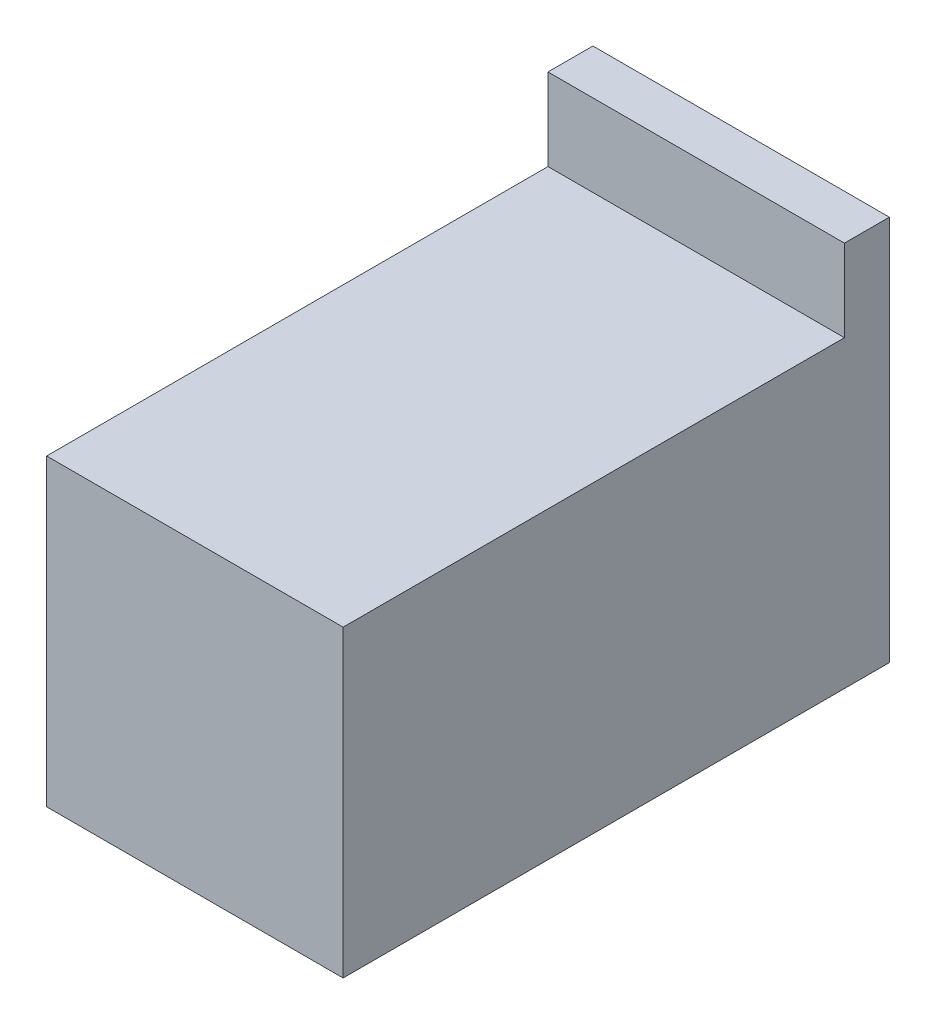
ISO-10303-21;
HEADER;
FILE_DESCRIPTION(('STEP AP214'),'2;1');
FILE_NAME('part.step','',(''),(''),'','','');
FILE_SCHEMA(('AUTOMOTIVE_DESIGN { 1 0 10303 214 1 1 1 1 }'));
ENDSEC;
DATA;
#1=APPLICATION_CONTEXT('core data for automotive mechanical design processes');
#2=APPLICATION_PROTOCOL_DEFINITION('international standard','automotive_design',2000,#1);
#3=PRODUCT_CONTEXT('',#1,'mechanical');
#4=PRODUCT('Part','Part','',(#3));
#5=PRODUCT_RELATED_PRODUCT_CATEGORY('part','',(#4));
#6=PRODUCT_DEFINITION_FORMATION('','',#4);
#7=PRODUCT_DEFINITION_CONTEXT('part definition',#1,'design');
#8=PRODUCT_DEFINITION('design','',#6,#7);
#9=PRODUCT_DEFINITION_SHAPE('','',#8);
#10=(LENGTH_UNIT() NAMED_UNIT(*) SI_UNIT(.MILLI.,.METRE.));
#11=(NAMED_UNIT(*) PLANE_ANGLE_UNIT() SI_UNIT($,.RADIAN.));
#12=(NAMED_UNIT(*) SI_UNIT($,.STERADIAN.) SOLID_ANGLE_UNIT());
#13=UNCERTAINTY_MEASURE_WITH_UNIT(LENGTH_MEASURE(1.E-05),#10,'distance_accuracy_value','');
#14=(GEOMETRIC_REPRESENTATION_CONTEXT(3) GLOBAL_UNCERTAINTY_ASSIGNED_CONTEXT((#13)) GLOBAL_UNIT_ASSIGNED_CONTEXT((#10,
#11,#12)) REPRESENTATION_CONTEXT('',''));
#15=CARTESIAN_POINT('',(0.,0.,0.));
#16=DIRECTION('',(0.,0.,1.));
#17=DIRECTION('',(1.,0.,0.));
#18=AXIS2_PLACEMENT_3D('',#15,#16,#17);
#19=CARTESIAN_POINT('',(-21.71,22.25,80.));
#20=DIRECTION('',(0.,-1.,0.));
#21=DIRECTION('',(0.,0.,-1.));
#22=AXIS2_PLACEMENT_3D('',#19,#20,#21);
#23=PLANE('',#22);
#24=DIRECTION('',(1.,0.,0.));
#25=VECTOR('',#24,1.);
#26=CARTESIAN_POINT('',(0.,22.25,6.58));
#27=LINE('',#26,#25);
#28=CARTESIAN_POINT('',(-21.71,22.25,6.58));
#29=VERTEX_POINT('',#28);
#30=CARTESIAN_POINT('',(21.71,22.25,6.58));
#31=VERTEX_POINT('',#30);
#32=EDGE_CURVE('E60',#29,#31,#27,.T.);
#33=ORIENTED_EDGE('',*,*,#32,.F.);
#34=DIRECTION('',(0.,0.,-1.));
#35=VECTOR('',#34,1.);
#36=CARTESIAN_POINT('',(-21.71,22.25,80.));
#37=LINE('',#36,#35);
#38=CARTESIAN_POINT('',(-21.71,22.25,80.));
#39=VERTEX_POINT('',#38);
#40=EDGE_CURVE('E54',#39,#29,#37,.T.);
#41=ORIENTED_EDGE('',*,*,#40,.F.);
#42=DIRECTION('',(-1.,0.,0.));
#43=VECTOR('',#42,1.);
#44=CARTESIAN_POINT('',(-21.71,22.25,80.));
#45=LINE('',#44,#43);
#46=CARTESIAN_POINT('',(21.71,22.25,80.));
#47=VERTEX_POINT('',#46);
#48=EDGE_CURVE('E89',#47,#39,#45,.T.);
#49=ORIENTED_EDGE('',*,*,#48,.F.);
#50=DIRECTION('',(0.,0.,-1.));
#51=VECTOR('',#50,1.);
#52=CARTESIAN_POINT('',(21.71,22.25,80.));
#53=LINE('',#52,#51);
#54=EDGE_CURVE('E11',#47,#31,#53,.T.);
#55=ORIENTED_EDGE('',*,*,#54,.T.);
#56=EDGE_LOOP('',(#33,#41,#49,#55));
#57=FACE_BOUND('',#56,.T.);
#58=ADVANCED_FACE('F45',(#57),#23,.F.);
#59=CARTESIAN_POINT('',(21.71,-22.25,80.));
#60=DIRECTION('',(-1.,0.,0.));
#61=DIRECTION('',(0.,0.,1.));
#62=AXIS2_PLACEMENT_3D('',#59,#60,#61);
#63=PLANE('',#62);
#64=DIRECTION('',(0.,1.,0.));
#65=VECTOR('',#64,1.);
#66=CARTESIAN_POINT('',(21.71,-22.25,0.));
#67=LINE('',#66,#65);
#68=CARTESIAN_POINT('',(21.71,-22.25,0.));
#69=VERTEX_POINT('',#68);
#70=CARTESIAN_POINT('',(21.71,34.25,0.));
#71=VERTEX_POINT('',#70);
#72=EDGE_CURVE('E131',#69,#71,#67,.T.);
#73=ORIENTED_EDGE('',*,*,#72,.T.);
#74=DIRECTION('',(0.,0.,-1.));
#75=VECTOR('',#74,1.);
#76=CARTESIAN_POINT('',(21.71,34.25,0.));
#77=LINE('',#76,#75);
#78=CARTESIAN_POINT('',(21.71,34.25,6.58));
#79=VERTEX_POINT('',#78);
#80=EDGE_CURVE('E117',#79,#71,#77,.T.);
#81=ORIENTED_EDGE('',*,*,#80,.F.);
#82=DIRECTION('',(0.,-1.,0.));
#83=VECTOR('',#82,1.);
#84=CARTESIAN_POINT('',(21.71,34.25,6.58));
#85=LINE('',#84,#83);
#86=EDGE_CURVE('E112',#79,#31,#85,.T.);
#87=ORIENTED_EDGE('',*,*,#86,.T.);
#88=ORIENTED_EDGE('',*,*,#54,.F.);
#89=DIRECTION('',(0.,1.,0.));
#90=VECTOR('',#89,1.);
#91=CARTESIAN_POINT('',(21.71,-22.25,80.));
#92=LINE('',#91,#90);
#93=CARTESIAN_POINT('',(21.71,-22.25,80.));
#94=VERTEX_POINT('',#93);
#95=EDGE_CURVE('E140',#94,#47,#92,.T.);
#96=ORIENTED_EDGE('',*,*,#95,.F.);
#97=DIRECTION('',(0.,0.,-1.));
#98=VECTOR('',#97,1.);
#99=CARTESIAN_POINT('',(21.71,-22.25,80.));
#100=LINE('',#99,#98);
#101=EDGE_CURVE('E149',#94,#69,#100,.T.);
#102=ORIENTED_EDGE('',*,*,#101,.T.);
#103=EDGE_LOOP('',(#73,#81,#87,#88,#96,#102));
#104=FACE_BOUND('',#103,.T.);
#105=ADVANCED_FACE('F47',(#104),#63,.F.);
#106=CARTESIAN_POINT('',(-21.71,-22.25,80.));
#107=DIRECTION('',(1.,0.,0.));
#108=DIRECTION('',(0.,0.,-1.));
#109=AXIS2_PLACEMENT_3D('',#106,#107,#108);
#110=PLANE('',#109);
#111=DIRECTION('',(0.,-1.,0.));
#112=VECTOR('',#111,1.);
#113=CARTESIAN_POINT('',(-21.71,-22.25,0.));
#114=LINE('',#113,#112);
#115=CARTESIAN_POINT('',(-21.71,34.25,0.));
#116=VERTEX_POINT('',#115);
#117=CARTESIAN_POINT('',(-21.71,-22.25,0.));
#118=VERTEX_POINT('',#117);
#119=EDGE_CURVE('E135',#116,#118,#114,.T.);
#120=ORIENTED_EDGE('',*,*,#119,.T.);
#121=DIRECTION('',(0.,0.,-1.));
#122=VECTOR('',#121,1.);
#123=CARTESIAN_POINT('',(-21.71,-22.25,80.));
#124=LINE('',#123,#122);
#125=CARTESIAN_POINT('',(-21.71,-22.25,80.));
#126=VERTEX_POINT('',#125);
#127=EDGE_CURVE('E157',#126,#118,#124,.T.);
#128=ORIENTED_EDGE('',*,*,#127,.F.);
#129=DIRECTION('',(0.,-1.,0.));
#130=VECTOR('',#129,1.);
#131=CARTESIAN_POINT('',(-21.71,-22.25,80.));
#132=LINE('',#131,#130);
#133=EDGE_CURVE('E145',#39,#126,#132,.T.);
#134=ORIENTED_EDGE('',*,*,#133,.F.);
#135=ORIENTED_EDGE('',*,*,#40,.T.);
#136=DIRECTION('',(0.,-1.,0.));
#137=VECTOR('',#136,1.);
#138=CARTESIAN_POINT('',(-21.71,34.25,6.58));
#139=LINE('',#138,#137);
#140=CARTESIAN_POINT('',(-21.71,34.25,6.58));
#141=VERTEX_POINT('',#140);
#142=EDGE_CURVE('E110',#141,#29,#139,.T.);
#143=ORIENTED_EDGE('',*,*,#142,.F.);
#144=DIRECTION('',(0.,0.,1.));
#145=VECTOR('',#144,1.);
#146=CARTESIAN_POINT('',(-21.71,34.25,0.));
#147=LINE('',#146,#145);
#148=EDGE_CURVE('E118',#116,#141,#147,.T.);
#149=ORIENTED_EDGE('',*,*,#148,.F.);
#150=EDGE_LOOP('',(#120,#128,#134,#135,#143,#149));
#151=FACE_BOUND('',#150,.T.);
#152=ADVANCED_FACE('F128',(#151),#110,.F.);
#153=CARTESIAN_POINT('',(-21.71,-22.25,80.));
#154=DIRECTION('',(0.,1.,0.));
#155=DIRECTION('',(0.,0.,1.));
#156=AXIS2_PLACEMENT_3D('',#153,#154,#155);
#157=PLANE('',#156);
#158=DIRECTION('',(1.,0.,0.));
#159=VECTOR('',#158,1.);
#160=CARTESIAN_POINT('',(-21.71,-22.25,0.));
#161=LINE('',#160,#159);
#162=EDGE_CURVE('E84',#118,#69,#161,.T.);
#163=ORIENTED_EDGE('',*,*,#162,.T.);
#164=ORIENTED_EDGE('',*,*,#101,.F.);
#165=DIRECTION('',(1.,0.,0.));
#166=VECTOR('',#165,1.);
#167=CARTESIAN_POINT('',(-21.71,-22.25,80.));
#168=LINE('',#167,#166);
#169=EDGE_CURVE('E69',#126,#94,#168,.T.);
#170=ORIENTED_EDGE('',*,*,#169,.F.);
#171=ORIENTED_EDGE('',*,*,#127,.T.);
#172=EDGE_LOOP('',(#163,#164,#170,#171));
#173=FACE_BOUND('',#172,.T.);
#174=ADVANCED_FACE('F161',(#173),#157,.F.);
#175=CARTESIAN_POINT('',(0.,0.,80.));
#176=DIRECTION('',(0.,0.,-1.));
#177=DIRECTION('',(-1.,0.,0.));
#178=AXIS2_PLACEMENT_3D('',#175,#176,#177);
#179=PLANE('',#178);
#180=ORIENTED_EDGE('',*,*,#95,.T.);
#181=ORIENTED_EDGE('',*,*,#48,.T.);
#182=ORIENTED_EDGE('',*,*,#133,.T.);
#183=ORIENTED_EDGE('',*,*,#169,.T.);
#184=EDGE_LOOP('',(#180,#181,#182,#183));
#185=FACE_BOUND('',#184,.T.);
#186=ADVANCED_FACE('F182',(#185),#179,.F.);
#187=CARTESIAN_POINT('',(0.,0.,0.));
#188=DIRECTION('',(0.,0.,-1.));
#189=DIRECTION('',(-1.,0.,0.));
#190=AXIS2_PLACEMENT_3D('',#187,#188,#189);
#191=PLANE('',#190);
#192=ORIENTED_EDGE('',*,*,#72,.F.);
#193=ORIENTED_EDGE('',*,*,#162,.F.);
#194=ORIENTED_EDGE('',*,*,#119,.F.);
#195=DIRECTION('',(-1.,0.,0.));
#196=VECTOR('',#195,1.);
#197=CARTESIAN_POINT('',(0.,34.25,0.));
#198=LINE('',#197,#196);
#199=EDGE_CURVE('E124',#71,#116,#198,.T.);
#200=ORIENTED_EDGE('',*,*,#199,.F.);
#201=EDGE_LOOP('',(#192,#193,#194,#200));
#202=FACE_BOUND('',#201,.T.);
#203=ADVANCED_FACE('F164',(#202),#191,.T.);
#204=CARTESIAN_POINT('',(0.,34.25,6.58));
#205=DIRECTION('',(0.,0.,-1.));
#206=DIRECTION('',(-1.,0.,0.));
#207=AXIS2_PLACEMENT_3D('',#204,#205,#206);
#208=PLANE('',#207);
#209=ORIENTED_EDGE('',*,*,#32,.T.);
#210=ORIENTED_EDGE('',*,*,#86,.F.);
#211=DIRECTION('',(1.,0.,0.));
#212=VECTOR('',#211,1.);
#213=CARTESIAN_POINT('',(0.,34.25,6.58));
#214=LINE('',#213,#212);
#215=EDGE_CURVE('E106',#141,#79,#214,.T.);
#216=ORIENTED_EDGE('',*,*,#215,.F.);
#217=ORIENTED_EDGE('',*,*,#142,.T.);
#218=EDGE_LOOP('',(#209,#210,#216,#217));
#219=FACE_BOUND('',#218,.T.);
#220=ADVANCED_FACE('F108',(#219),#208,.F.);
#221=CARTESIAN_POINT('',(0.,34.25,0.));
#222=DIRECTION('',(0.,1.,0.));
#223=DIRECTION('',(0.,0.,1.));
#224=AXIS2_PLACEMENT_3D('',#221,#222,#223);
#225=PLANE('',#224);
#226=ORIENTED_EDGE('',*,*,#148,.T.);
#227=ORIENTED_EDGE('',*,*,#215,.T.);
#228=ORIENTED_EDGE('',*,*,#80,.T.);
#229=ORIENTED_EDGE('',*,*,#199,.T.);
#230=EDGE_LOOP('',(#226,#227,#228,#229));
#231=FACE_BOUND('',#230,.T.);
#232=ADVANCED_FACE('F122',(#231),#225,.T.);
#233=CLOSED_SHELL('',(#58,#105,#152,#174,#186,#203,#220,#232));
#234=MANIFOLD_SOLID_BREP('B2',#233);
#235=ADVANCED_BREP_SHAPE_REPRESENTATION('',(#18,#234),#14);
#236=SHAPE_DEFINITION_REPRESENTATION(#9,#235);
ENDSEC;
END-ISO-10303-21;
